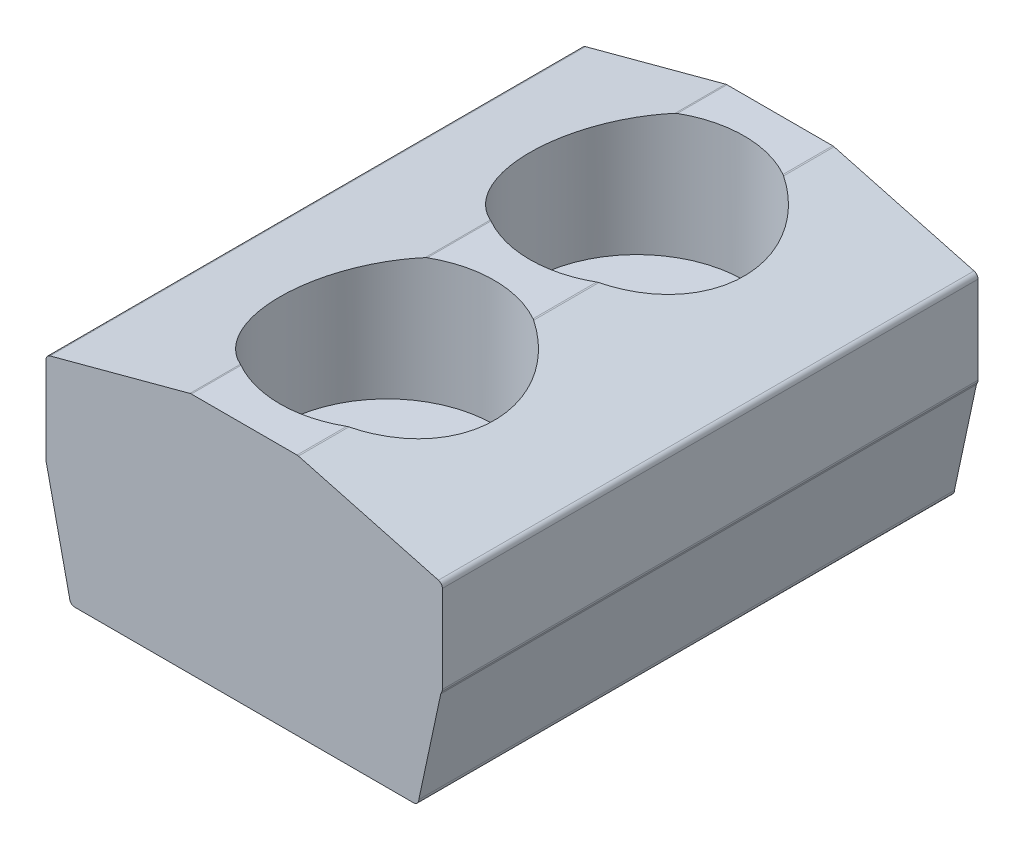
ISO-10303-21;
HEADER;
FILE_DESCRIPTION(('STEP AP214'),'2;1');
FILE_NAME('part.step','',(''),(''),'','','');
FILE_SCHEMA(('AUTOMOTIVE_DESIGN { 1 0 10303 214 1 1 1 1 }'));
ENDSEC;
DATA;
#1=APPLICATION_CONTEXT('core data for automotive mechanical design processes');
#2=APPLICATION_PROTOCOL_DEFINITION('international standard','automotive_design',2000,#1);
#3=PRODUCT_CONTEXT('',#1,'mechanical');
#4=PRODUCT('Part','Part','',(#3));
#5=PRODUCT_RELATED_PRODUCT_CATEGORY('part','',(#4));
#6=PRODUCT_DEFINITION_FORMATION('','',#4);
#7=PRODUCT_DEFINITION_CONTEXT('part definition',#1,'design');
#8=PRODUCT_DEFINITION('design','',#6,#7);
#9=PRODUCT_DEFINITION_SHAPE('','',#8);
#10=(LENGTH_UNIT() NAMED_UNIT(*) SI_UNIT(.MILLI.,.METRE.));
#11=(NAMED_UNIT(*) PLANE_ANGLE_UNIT() SI_UNIT($,.RADIAN.));
#12=(NAMED_UNIT(*) SI_UNIT($,.STERADIAN.) SOLID_ANGLE_UNIT());
#13=UNCERTAINTY_MEASURE_WITH_UNIT(LENGTH_MEASURE(1.E-05),#10,'distance_accuracy_value','');
#14=(GEOMETRIC_REPRESENTATION_CONTEXT(3) GLOBAL_UNCERTAINTY_ASSIGNED_CONTEXT((#13)) GLOBAL_UNIT_ASSIGNED_CONTEXT((#10,
#11,#12)) REPRESENTATION_CONTEXT('',''));
#15=CARTESIAN_POINT('',(0.,0.,0.));
#16=DIRECTION('',(0.,0.,1.));
#17=DIRECTION('',(1.,0.,0.));
#18=AXIS2_PLACEMENT_3D('',#15,#16,#17);
#19=CARTESIAN_POINT('',(3.65950834964065,10.7124404272445,8.));
#20=DIRECTION('',(0.,-1.,0.));
#21=DIRECTION('',(1.,0.,0.));
#22=AXIS2_PLACEMENT_3D('',#19,#20,#21);
#23=CYLINDRICAL_SURFACE('',#22,3.2);
#24=CARTESIAN_POINT('',(3.65950834964065,-2.89439986210309,8.));
#25=DIRECTION('',(0.,-1.,0.));
#26=DIRECTION('',(1.,0.,0.));
#27=AXIS2_PLACEMENT_3D('',#24,#25,#26);
#28=CIRCLE('',#27,3.2);
#29=CARTESIAN_POINT('',(6.85950834964065,-2.89439986210309,8.));
#30=VERTEX_POINT('',#29);
#31=EDGE_CURVE('E440',#30,#30,#28,.T.);
#32=ORIENTED_EDGE('',*,*,#31,.T.);
#33=EDGE_LOOP('',(#32));
#34=FACE_BOUND('',#33,.T.);
#35=CARTESIAN_POINT('',(3.65950834964065,3.7124404272445,8.));
#36=DIRECTION('',(0.,1.,0.));
#37=DIRECTION('',(0.,0.,1.));
#38=AXIS2_PLACEMENT_3D('',#35,#36,#37);
#39=CIRCLE('',#38,3.2);
#40=CARTESIAN_POINT('',(3.65950834964065,3.7124404272445,11.2));
#41=VERTEX_POINT('',#40);
#42=EDGE_CURVE('E527',#41,#41,#39,.F.);
#43=ORIENTED_EDGE('',*,*,#42,.F.);
#44=EDGE_LOOP('',(#43));
#45=FACE_BOUND('',#44,.T.);
#46=ADVANCED_FACE('F45',(#34,#45),#23,.F.);
#47=CARTESIAN_POINT('',(3.65950834964065,10.7124404272445,22.));
#48=DIRECTION('',(0.,-1.,0.));
#49=DIRECTION('',(1.,0.,0.));
#50=AXIS2_PLACEMENT_3D('',#47,#48,#49);
#51=CYLINDRICAL_SURFACE('',#50,3.2);
#52=CARTESIAN_POINT('',(3.65950834964065,-2.89439986210309,22.));
#53=DIRECTION('',(0.,-1.,0.));
#54=DIRECTION('',(1.,0.,0.));
#55=AXIS2_PLACEMENT_3D('',#52,#53,#54);
#56=CIRCLE('',#55,3.2);
#57=CARTESIAN_POINT('',(6.85950834964065,-2.89439986210309,22.));
#58=VERTEX_POINT('',#57);
#59=EDGE_CURVE('E390',#58,#58,#56,.T.);
#60=ORIENTED_EDGE('',*,*,#59,.T.);
#61=EDGE_LOOP('',(#60));
#62=FACE_BOUND('',#61,.T.);
#63=CARTESIAN_POINT('',(3.65950834964065,3.7124404272445,22.));
#64=DIRECTION('',(0.,1.,0.));
#65=DIRECTION('',(0.,0.,1.));
#66=AXIS2_PLACEMENT_3D('',#63,#64,#65);
#67=CIRCLE('',#66,3.2);
#68=CARTESIAN_POINT('',(3.65950834964065,3.7124404272445,25.2));
#69=VERTEX_POINT('',#68);
#70=EDGE_CURVE('E811',#69,#69,#67,.F.);
#71=ORIENTED_EDGE('',*,*,#70,.F.);
#72=EDGE_LOOP('',(#71));
#73=FACE_BOUND('',#72,.T.);
#74=ADVANCED_FACE('F558',(#62,#73),#51,.F.);
#75=CARTESIAN_POINT('',(6.62001260036443,10.4124404272445,30.));
#76=DIRECTION('',(0.,0.,-1.));
#77=DIRECTION('',(-1.,0.,0.));
#78=AXIS2_PLACEMENT_3D('',#75,#76,#77);
#79=CYLINDRICAL_SURFACE('',#78,0.3);
#80=DIRECTION('',(0.,0.,-1.));
#81=VECTOR('',#80,1.);
#82=CARTESIAN_POINT('',(6.69765831389518,10.7022181751312,30.));
#83=LINE('',#82,#81);
#84=CARTESIAN_POINT('',(6.69765831389518,10.7022181751312,30.));
#85=VERTEX_POINT('',#84);
#86=CARTESIAN_POINT('',(6.69765831389518,10.7022181751312,27.1739390018341));
#87=VERTEX_POINT('',#86);
#88=EDGE_CURVE('E233',#85,#87,#83,.T.);
#89=ORIENTED_EDGE('',*,*,#88,.T.);
#90=CARTESIAN_POINT('',(6.69765831389518,10.7022181751312,27.1739390018341));
#91=CARTESIAN_POINT('',(6.68494068704995,10.7056182745848,27.1814084927951));
#92=CARTESIAN_POINT('',(6.67211139749972,10.7081701786544,27.1888779912677));
#93=CARTESIAN_POINT('',(6.64622949298947,10.7115775960255,27.2038170032363));
#94=CARTESIAN_POINT('',(6.63317687802944,10.712433109327,27.2112865167322));
#95=CARTESIAN_POINT('',(6.62001260036442,10.7124404272445,27.2187560377399));
#96=B_SPLINE_CURVE_WITH_KNOTS('',3,(#90,#91,#92,#93,#94,#95),.UNSPECIFIED.,.F.,.F.,(4,2,4),(0.,
0.0451892313454202,0.0903784626901645),.UNSPECIFIED.);
#97=CARTESIAN_POINT('',(6.62001260036443,10.7124404272445,27.2187560377399));
#98=VERTEX_POINT('',#97);
#99=EDGE_CURVE('E213',#87,#98,#96,.T.);
#100=ORIENTED_EDGE('',*,*,#99,.T.);
#101=DIRECTION('',(0.,0.,-1.));
#102=VECTOR('',#101,1.);
#103=CARTESIAN_POINT('',(6.62001260036443,10.7124404272445,30.));
#104=LINE('',#103,#102);
#105=CARTESIAN_POINT('',(6.62001260036443,10.7124404272445,30.));
#106=VERTEX_POINT('',#105);
#107=EDGE_CURVE('E230',#106,#98,#104,.T.);
#108=ORIENTED_EDGE('',*,*,#107,.F.);
#109=CARTESIAN_POINT('',(6.62001260036443,10.4124404272445,30.));
#110=DIRECTION('',(0.,0.,1.));
#111=DIRECTION('',(1.,0.,0.));
#112=AXIS2_PLACEMENT_3D('',#109,#110,#111);
#113=CIRCLE('',#112,0.3);
#114=EDGE_CURVE('E431',#85,#106,#113,.T.);
#115=ORIENTED_EDGE('',*,*,#114,.F.);
#116=EDGE_LOOP('',(#89,#100,#108,#115));
#117=FACE_BOUND('',#116,.T.);
#118=ADVANCED_FACE('F228',(#117),#79,.T.);
#119=CARTESIAN_POINT('',(6.69765831389518,10.7022181751312,16.8260609981659));
#120=VERTEX_POINT('',#119);
#121=CARTESIAN_POINT('',(6.69765831389518,10.7022181751312,13.1739390018341));
#122=VERTEX_POINT('',#121);
#123=EDGE_CURVE('E246',#120,#122,#83,.T.);
#124=ORIENTED_EDGE('',*,*,#123,.T.);
#125=CARTESIAN_POINT('',(6.69765831389518,10.7022181751312,13.1739390018341));
#126=CARTESIAN_POINT('',(6.68494068704995,10.7056182745848,13.1814084927951));
#127=CARTESIAN_POINT('',(6.67211139749972,10.7081701786544,13.1888779912677));
#128=CARTESIAN_POINT('',(6.64622949298947,10.7115775960255,13.2038170032363));
#129=CARTESIAN_POINT('',(6.63317687802945,10.712433109327,13.2112865167322));
#130=CARTESIAN_POINT('',(6.62001260036443,10.7124404272445,13.2187560377399));
#131=B_SPLINE_CURVE_WITH_KNOTS('',3,(#125,#126,#127,#128,#129,#130),.UNSPECIFIED.,.F.,.F.,(4,2,
4),(0.,0.0451892313454202,0.0903784626901631),.UNSPECIFIED.);
#132=CARTESIAN_POINT('',(6.62001260036443,10.7124404272445,13.2187560377399));
#133=VERTEX_POINT('',#132);
#134=EDGE_CURVE('E444',#122,#133,#131,.T.);
#135=ORIENTED_EDGE('',*,*,#134,.T.);
#136=CARTESIAN_POINT('',(6.62001260036443,10.7124404272445,16.7812439622601));
#137=VERTEX_POINT('',#136);
#138=EDGE_CURVE('E241',#137,#133,#104,.T.);
#139=ORIENTED_EDGE('',*,*,#138,.F.);
#140=CARTESIAN_POINT('',(6.62001260036443,10.7124404272445,16.7812439622601));
#141=CARTESIAN_POINT('',(6.63317687802944,10.712433109327,16.7887134832678));
#142=CARTESIAN_POINT('',(6.64622949298947,10.7115775960255,16.7961829967637));
#143=CARTESIAN_POINT('',(6.67211139749972,10.7081701786544,16.8111220087323));
#144=CARTESIAN_POINT('',(6.68494068704995,10.7056182745848,16.8185915072049));
#145=CARTESIAN_POINT('',(6.69765831389518,10.7022181751312,16.8260609981659));
#146=B_SPLINE_CURVE_WITH_KNOTS('',3,(#140,#141,#142,#143,#144,#145),.UNSPECIFIED.,.F.,.F.,(4,2,
4),(0.,0.0451892313447453,0.0903784626901623),.UNSPECIFIED.);
#147=EDGE_CURVE('E235',#137,#120,#146,.T.);
#148=ORIENTED_EDGE('',*,*,#147,.T.);
#149=EDGE_LOOP('',(#124,#135,#139,#148));
#150=FACE_BOUND('',#149,.T.);
#151=ADVANCED_FACE('F553',(#150),#79,.T.);
#152=CARTESIAN_POINT('',(6.62001260036443,10.7124404272445,30.));
#153=DIRECTION('',(0.,-1.,0.));
#154=DIRECTION('',(0.,0.,-1.));
#155=AXIS2_PLACEMENT_3D('',#152,#153,#154);
#156=PLANE('',#155);
#157=ORIENTED_EDGE('',*,*,#107,.T.);
#158=CARTESIAN_POINT('',(3.65950834964065,10.7124404272445,22.));
#159=DIRECTION('',(0.,1.,0.));
#160=DIRECTION('',(0.,0.,1.));
#161=AXIS2_PLACEMENT_3D('',#158,#159,#160);
#162=CIRCLE('',#161,6.);
#163=CARTESIAN_POINT('',(0.699004098916885,10.7124404272445,27.2187560377399));
#164=VERTEX_POINT('',#163);
#165=EDGE_CURVE('E210',#164,#98,#162,.T.);
#166=ORIENTED_EDGE('',*,*,#165,.F.);
#167=DIRECTION('',(0.,0.,-1.));
#168=VECTOR('',#167,1.);
#169=CARTESIAN_POINT('',(0.699004098916885,10.7124404272445,30.));
#170=LINE('',#169,#168);
#171=CARTESIAN_POINT('',(0.699004098916885,10.7124404272445,30.));
#172=VERTEX_POINT('',#171);
#173=EDGE_CURVE('E251',#172,#164,#170,.T.);
#174=ORIENTED_EDGE('',*,*,#173,.F.);
#175=DIRECTION('',(-1.,0.,0.));
#176=VECTOR('',#175,1.);
#177=CARTESIAN_POINT('',(6.62001260036443,10.7124404272445,30.));
#178=LINE('',#177,#176);
#179=EDGE_CURVE('E238',#106,#172,#178,.T.);
#180=ORIENTED_EDGE('',*,*,#179,.F.);
#181=EDGE_LOOP('',(#157,#166,#174,#180));
#182=FACE_BOUND('',#181,.T.);
#183=ADVANCED_FACE('F237',(#182),#156,.F.);
#184=ORIENTED_EDGE('',*,*,#138,.T.);
#185=CARTESIAN_POINT('',(3.65950834964065,10.7124404272445,8.));
#186=DIRECTION('',(0.,1.,0.));
#187=DIRECTION('',(0.,0.,1.));
#188=AXIS2_PLACEMENT_3D('',#185,#186,#187);
#189=CIRCLE('',#188,6.);
#190=CARTESIAN_POINT('',(0.699004098916885,10.7124404272445,13.2187560377399));
#191=VERTEX_POINT('',#190);
#192=EDGE_CURVE('E825',#191,#133,#189,.T.);
#193=ORIENTED_EDGE('',*,*,#192,.F.);
#194=CARTESIAN_POINT('',(0.699004098916885,10.7124404272445,16.7812439622601));
#195=VERTEX_POINT('',#194);
#196=EDGE_CURVE('E258',#195,#191,#170,.T.);
#197=ORIENTED_EDGE('',*,*,#196,.F.);
#198=EDGE_CURVE('E222',#137,#195,#162,.T.);
#199=ORIENTED_EDGE('',*,*,#198,.F.);
#200=EDGE_LOOP('',(#184,#193,#197,#199));
#201=FACE_BOUND('',#200,.T.);
#202=ADVANCED_FACE('F548',(#201),#156,.F.);
#203=CARTESIAN_POINT('',(0.699004098916885,10.4124404272445,30.));
#204=DIRECTION('',(0.,0.,-1.));
#205=DIRECTION('',(-1.,0.,0.));
#206=AXIS2_PLACEMENT_3D('',#203,#204,#205);
#207=CYLINDRICAL_SURFACE('',#206,0.3);
#208=ORIENTED_EDGE('',*,*,#173,.T.);
#209=CARTESIAN_POINT('',(0.699004098916885,10.7124404272445,27.2187560377399));
#210=CARTESIAN_POINT('',(0.685839821251867,10.712433109327,27.2112865167322));
#211=CARTESIAN_POINT('',(0.672787206291843,10.7115775960255,27.2038170032363));
#212=CARTESIAN_POINT('',(0.64690530178159,10.7081701786544,27.1888779912677));
#213=CARTESIAN_POINT('',(0.634076012231364,10.7056182745848,27.1814084927951));
#214=CARTESIAN_POINT('',(0.621358385386135,10.7022181751312,27.1739390018341));
#215=B_SPLINE_CURVE_WITH_KNOTS('',3,(#209,#210,#211,#212,#213,#214),.UNSPECIFIED.,.F.,.F.,(4,2,
4),(0.,0.0451892313447418,0.0903784626901581),.UNSPECIFIED.);
#216=CARTESIAN_POINT('',(0.621358385386134,10.7022181751312,27.1739390018341));
#217=VERTEX_POINT('',#216);
#218=EDGE_CURVE('E216',#164,#217,#215,.T.);
#219=ORIENTED_EDGE('',*,*,#218,.T.);
#220=DIRECTION('',(0.,0.,-1.));
#221=VECTOR('',#220,1.);
#222=CARTESIAN_POINT('',(0.621358385386134,10.7022181751312,30.));
#223=LINE('',#222,#221);
#224=CARTESIAN_POINT('',(0.621358385386134,10.7022181751312,30.));
#225=VERTEX_POINT('',#224);
#226=EDGE_CURVE('E266',#225,#217,#223,.T.);
#227=ORIENTED_EDGE('',*,*,#226,.F.);
#228=CARTESIAN_POINT('',(0.699004098916885,10.4124404272445,30.));
#229=DIRECTION('',(0.,0.,1.));
#230=DIRECTION('',(1.,0.,0.));
#231=AXIS2_PLACEMENT_3D('',#228,#229,#230);
#232=CIRCLE('',#231,0.3);
#233=EDGE_CURVE('E426',#172,#225,#232,.T.);
#234=ORIENTED_EDGE('',*,*,#233,.F.);
#235=EDGE_LOOP('',(#208,#219,#227,#234));
#236=FACE_BOUND('',#235,.T.);
#237=ADVANCED_FACE('F520',(#236),#207,.T.);
#238=ORIENTED_EDGE('',*,*,#196,.T.);
#239=CARTESIAN_POINT('',(0.699004098916885,10.7124404272445,13.2187560377399));
#240=CARTESIAN_POINT('',(0.685839821251867,10.712433109327,13.2112865167322));
#241=CARTESIAN_POINT('',(0.672787206291843,10.7115775960255,13.2038170032363));
#242=CARTESIAN_POINT('',(0.646905301781589,10.7081701786544,13.1888779912677));
#243=CARTESIAN_POINT('',(0.634076012231363,10.7056182745848,13.1814084927951));
#244=CARTESIAN_POINT('',(0.621358385386133,10.7022181751312,13.1739390018341));
#245=B_SPLINE_CURVE_WITH_KNOTS('',3,(#239,#240,#241,#242,#243,#244),.UNSPECIFIED.,.F.,.F.,(4,2,
4),(0.,0.0451892313447426,0.0903784626901613),.UNSPECIFIED.);
#246=CARTESIAN_POINT('',(0.621358385386134,10.7022181751312,13.1739390018341));
#247=VERTEX_POINT('',#246);
#248=EDGE_CURVE('E482',#191,#247,#245,.T.);
#249=ORIENTED_EDGE('',*,*,#248,.T.);
#250=CARTESIAN_POINT('',(0.621358385386134,10.7022181751312,16.8260609981659));
#251=VERTEX_POINT('',#250);
#252=EDGE_CURVE('E272',#251,#247,#223,.T.);
#253=ORIENTED_EDGE('',*,*,#252,.F.);
#254=CARTESIAN_POINT('',(0.621358385386134,10.7022181751312,16.8260609981659));
#255=CARTESIAN_POINT('',(0.634076012231363,10.7056182745848,16.8185915072049));
#256=CARTESIAN_POINT('',(0.646905301781589,10.7081701786544,16.8111220087323));
#257=CARTESIAN_POINT('',(0.672787206291843,10.7115775960255,16.7961829967637));
#258=CARTESIAN_POINT('',(0.685839821251867,10.712433109327,16.7887134832678));
#259=CARTESIAN_POINT('',(0.699004098916885,10.7124404272445,16.7812439622601));
#260=B_SPLINE_CURVE_WITH_KNOTS('',3,(#254,#255,#256,#257,#258,#259),.UNSPECIFIED.,.F.,.F.,(4,2,
4),(0.,0.0451892313454174,0.0903784626901597),.UNSPECIFIED.);
#261=EDGE_CURVE('E68',#251,#195,#260,.T.);
#262=ORIENTED_EDGE('',*,*,#261,.T.);
#263=EDGE_LOOP('',(#238,#249,#253,#262));
#264=FACE_BOUND('',#263,.T.);
#265=ADVANCED_FACE('F542',(#264),#207,.T.);
#266=CARTESIAN_POINT('',(14.4595083496407,8.31185387215871,30.));
#267=DIRECTION('',(0.,0.,-1.));
#268=DIRECTION('',(-1.,0.,0.));
#269=AXIS2_PLACEMENT_3D('',#266,#267,#268);
#270=CYLINDRICAL_SURFACE('',#269,0.3);
#271=CARTESIAN_POINT('',(14.4595083496407,8.31185387215871,0.));
#272=DIRECTION('',(0.,0.,1.));
#273=DIRECTION('',(1.,0.,0.));
#274=AXIS2_PLACEMENT_3D('',#271,#272,#273);
#275=CIRCLE('',#274,0.3);
#276=CARTESIAN_POINT('',(14.7595083496407,8.31185387215871,0.));
#277=VERTEX_POINT('',#276);
#278=CARTESIAN_POINT('',(14.5371540631714,8.60163162004543,0.));
#279=VERTEX_POINT('',#278);
#280=EDGE_CURVE('E386',#277,#279,#275,.T.);
#281=ORIENTED_EDGE('',*,*,#280,.T.);
#282=DIRECTION('',(0.,0.,-1.));
#283=VECTOR('',#282,1.);
#284=CARTESIAN_POINT('',(14.5371540631714,8.60163162004543,30.));
#285=LINE('',#284,#283);
#286=CARTESIAN_POINT('',(14.5371540631714,8.60163162004543,30.));
#287=VERTEX_POINT('',#286);
#288=EDGE_CURVE('E802',#287,#279,#285,.T.);
#289=ORIENTED_EDGE('',*,*,#288,.F.);
#290=CARTESIAN_POINT('',(14.4595083496407,8.31185387215871,30.));
#291=DIRECTION('',(0.,0.,1.));
#292=DIRECTION('',(1.,0.,0.));
#293=AXIS2_PLACEMENT_3D('',#290,#291,#292);
#294=CIRCLE('',#293,0.3);
#295=CARTESIAN_POINT('',(14.7595083496407,8.31185387215871,30.));
#296=VERTEX_POINT('',#295);
#297=EDGE_CURVE('E339',#296,#287,#294,.T.);
#298=ORIENTED_EDGE('',*,*,#297,.F.);
#299=DIRECTION('',(0.,0.,-1.));
#300=VECTOR('',#299,1.);
#301=CARTESIAN_POINT('',(14.7595083496407,8.31185387215871,30.));
#302=LINE('',#301,#300);
#303=EDGE_CURVE('E331',#296,#277,#302,.T.);
#304=ORIENTED_EDGE('',*,*,#303,.T.);
#305=EDGE_LOOP('',(#281,#289,#298,#304));
#306=FACE_BOUND('',#305,.T.);
#307=ADVANCED_FACE('F47',(#306),#270,.T.);
#308=CARTESIAN_POINT('',(8.4920826036523,10.221403635812,30.));
#309=DIRECTION('',(-0.258819045102521,-0.965925826289068,0.));
#310=DIRECTION('',(0.965925826289068,-0.258819045102521,0.));
#311=AXIS2_PLACEMENT_3D('',#308,#309,#310);
#312=PLANE('',#311);
#313=CARTESIAN_POINT('',(6.69765831389518,10.7022181751312,2.82606099816588));
#314=VERTEX_POINT('',#313);
#315=CARTESIAN_POINT('',(6.69765831389518,10.7022181751312,0.));
#316=VERTEX_POINT('',#315);
#317=EDGE_CURVE('E240',#314,#316,#83,.T.);
#318=ORIENTED_EDGE('',*,*,#317,.F.);
#319=CARTESIAN_POINT('',(3.65950834964065,11.5162880045379,8.));
#320=DIRECTION('',(-0.258819045102521,-0.965925826289068,0.));
#321=DIRECTION('',(-0.965925826289068,0.258819045102521,0.));
#322=AXIS2_PLACEMENT_3D('',#319,#320,#321);
#323=ELLIPSE('',#322,6.2116570824605,6.);
#324=EDGE_CURVE('E457',#314,#122,#323,.T.);
#325=ORIENTED_EDGE('',*,*,#324,.T.);
#326=ORIENTED_EDGE('',*,*,#123,.F.);
#327=CARTESIAN_POINT('',(3.65950834964065,11.5162880045379,22.));
#328=DIRECTION('',(-0.258819045102521,-0.965925826289068,0.));
#329=DIRECTION('',(-0.965925826289068,0.258819045102521,0.));
#330=AXIS2_PLACEMENT_3D('',#327,#328,#329);
#331=ELLIPSE('',#330,6.2116570824605,6.);
#332=EDGE_CURVE('E522',#120,#87,#331,.T.);
#333=ORIENTED_EDGE('',*,*,#332,.T.);
#334=ORIENTED_EDGE('',*,*,#88,.F.);
#335=DIRECTION('',(-0.965925826289068,0.258819045102521,0.));
#336=VECTOR('',#335,1.);
#337=CARTESIAN_POINT('',(14.5371540631714,8.60163162004543,30.));
#338=LINE('',#337,#336);
#339=EDGE_CURVE('E434',#287,#85,#338,.T.);
#340=ORIENTED_EDGE('',*,*,#339,.F.);
#341=ORIENTED_EDGE('',*,*,#288,.T.);
#342=DIRECTION('',(-0.965925826289068,0.258819045102521,0.));
#343=VECTOR('',#342,1.);
#344=CARTESIAN_POINT('',(8.4920826036523,10.221403635812,0.));
#345=LINE('',#344,#343);
#346=EDGE_CURVE('E382',#279,#316,#345,.T.);
#347=ORIENTED_EDGE('',*,*,#346,.T.);
#348=EDGE_LOOP('',(#318,#325,#326,#333,#334,#340,#341,#347));
#349=FACE_BOUND('',#348,.T.);
#350=ADVANCED_FACE('F552',(#349),#312,.F.);
#351=CARTESIAN_POINT('',(6.62001260036443,10.7124404272445,2.78124396226012));
#352=VERTEX_POINT('',#351);
#353=CARTESIAN_POINT('',(6.62001260036443,10.7124404272445,0.));
#354=VERTEX_POINT('',#353);
#355=EDGE_CURVE('E243',#352,#354,#104,.T.);
#356=ORIENTED_EDGE('',*,*,#355,.F.);
#357=CARTESIAN_POINT('',(6.62001260036443,10.7124404272445,2.78124396226012));
#358=CARTESIAN_POINT('',(6.63317687802944,10.712433109327,2.78871348326777));
#359=CARTESIAN_POINT('',(6.64622949298947,10.7115775960255,2.79618299676372));
#360=CARTESIAN_POINT('',(6.67211139749972,10.7081701786544,2.81112200873231));
#361=CARTESIAN_POINT('',(6.68494068704995,10.7056182745848,2.81859150720495));
#362=CARTESIAN_POINT('',(6.69765831389518,10.7022181751312,2.82606099816588));
#363=B_SPLINE_CURVE_WITH_KNOTS('',3,(#357,#358,#359,#360,#361,#362),.UNSPECIFIED.,.F.,.F.,(4,2,
4),(0.,0.0451892313447434,0.0903784626901627),.UNSPECIFIED.);
#364=EDGE_CURVE('E487',#352,#314,#363,.T.);
#365=ORIENTED_EDGE('',*,*,#364,.T.);
#366=ORIENTED_EDGE('',*,*,#317,.T.);
#367=CARTESIAN_POINT('',(6.62001260036443,10.4124404272445,0.));
#368=DIRECTION('',(0.,0.,1.));
#369=DIRECTION('',(1.,0.,0.));
#370=AXIS2_PLACEMENT_3D('',#367,#368,#369);
#371=CIRCLE('',#370,0.3);
#372=EDGE_CURVE('E379',#316,#354,#371,.T.);
#373=ORIENTED_EDGE('',*,*,#372,.T.);
#374=EDGE_LOOP('',(#356,#365,#366,#373));
#375=FACE_BOUND('',#374,.T.);
#376=ADVANCED_FACE('F459',(#375),#79,.T.);
#377=CARTESIAN_POINT('',(0.699004098916885,10.7124404272445,2.78124396226012));
#378=VERTEX_POINT('',#377);
#379=CARTESIAN_POINT('',(0.699004098916885,10.7124404272445,0.));
#380=VERTEX_POINT('',#379);
#381=EDGE_CURVE('E259',#378,#380,#170,.T.);
#382=ORIENTED_EDGE('',*,*,#381,.F.);
#383=EDGE_CURVE('E505',#352,#378,#189,.T.);
#384=ORIENTED_EDGE('',*,*,#383,.F.);
#385=ORIENTED_EDGE('',*,*,#355,.T.);
#386=DIRECTION('',(-1.,0.,0.));
#387=VECTOR('',#386,1.);
#388=CARTESIAN_POINT('',(6.62001260036443,10.7124404272445,0.));
#389=LINE('',#388,#387);
#390=EDGE_CURVE('E376',#354,#380,#389,.T.);
#391=ORIENTED_EDGE('',*,*,#390,.T.);
#392=EDGE_LOOP('',(#382,#384,#385,#391));
#393=FACE_BOUND('',#392,.T.);
#394=ADVANCED_FACE('F504',(#393),#156,.F.);
#395=CARTESIAN_POINT('',(0.621358385386134,10.7022181751312,2.82606099816589));
#396=VERTEX_POINT('',#395);
#397=CARTESIAN_POINT('',(0.621358385386134,10.7022181751312,0.));
#398=VERTEX_POINT('',#397);
#399=EDGE_CURVE('E273',#396,#398,#223,.T.);
#400=ORIENTED_EDGE('',*,*,#399,.F.);
#401=CARTESIAN_POINT('',(0.621358385386134,10.7022181751312,2.82606099816588));
#402=CARTESIAN_POINT('',(0.634076012231363,10.7056182745848,2.81859150720495));
#403=CARTESIAN_POINT('',(0.646905301781589,10.7081701786544,2.81112200873231));
#404=CARTESIAN_POINT('',(0.672787206291843,10.7115775960255,2.79618299676372));
#405=CARTESIAN_POINT('',(0.685839821251867,10.712433109327,2.78871348326777));
#406=CARTESIAN_POINT('',(0.699004098916885,10.7124404272445,2.78124396226012));
#407=B_SPLINE_CURVE_WITH_KNOTS('',3,(#401,#402,#403,#404,#405,#406),.UNSPECIFIED.,.F.,.F.,(4,2,
4),(0.,0.0451892313454184,0.0903784626901609),.UNSPECIFIED.);
#408=EDGE_CURVE('E61',#396,#378,#407,.T.);
#409=ORIENTED_EDGE('',*,*,#408,.T.);
#410=ORIENTED_EDGE('',*,*,#381,.T.);
#411=CARTESIAN_POINT('',(0.699004098916885,10.4124404272445,0.));
#412=DIRECTION('',(0.,0.,1.));
#413=DIRECTION('',(1.,0.,0.));
#414=AXIS2_PLACEMENT_3D('',#411,#412,#413);
#415=CIRCLE('',#414,0.3);
#416=EDGE_CURVE('E373',#380,#398,#415,.T.);
#417=ORIENTED_EDGE('',*,*,#416,.T.);
#418=EDGE_LOOP('',(#400,#409,#410,#417));
#419=FACE_BOUND('',#418,.T.);
#420=ADVANCED_FACE('F503',(#419),#207,.T.);
#421=CARTESIAN_POINT('',(-5.6079173963477,9.03308875998489,30.));
#422=DIRECTION('',(0.258819045102522,-0.965925826289068,0.));
#423=DIRECTION('',(0.965925826289068,0.258819045102522,0.));
#424=AXIS2_PLACEMENT_3D('',#421,#422,#423);
#425=PLANE('',#424);
#426=ORIENTED_EDGE('',*,*,#252,.T.);
#427=CARTESIAN_POINT('',(3.65950834964065,11.5162880045379,8.));
#428=DIRECTION('',(0.258819045102522,-0.965925826289068,0.));
#429=DIRECTION('',(0.965925826289068,0.258819045102522,0.));
#430=AXIS2_PLACEMENT_3D('',#427,#428,#429);
#431=ELLIPSE('',#430,6.2116570824605,6.);
#432=EDGE_CURVE('E11',#247,#396,#431,.T.);
#433=ORIENTED_EDGE('',*,*,#432,.T.);
#434=ORIENTED_EDGE('',*,*,#399,.T.);
#435=DIRECTION('',(-0.965925826289068,-0.258819045102522,0.));
#436=VECTOR('',#435,1.);
#437=CARTESIAN_POINT('',(-5.6079173963477,9.03308875998489,0.));
#438=LINE('',#437,#436);
#439=CARTESIAN_POINT('',(-7.2181373638901,8.60163162004543,0.));
#440=VERTEX_POINT('',#439);
#441=EDGE_CURVE('E370',#398,#440,#438,.T.);
#442=ORIENTED_EDGE('',*,*,#441,.T.);
#443=DIRECTION('',(0.,0.,-1.));
#444=VECTOR('',#443,1.);
#445=CARTESIAN_POINT('',(-7.2181373638901,8.60163162004543,30.));
#446=LINE('',#445,#444);
#447=CARTESIAN_POINT('',(-7.2181373638901,8.60163162004543,30.));
#448=VERTEX_POINT('',#447);
#449=EDGE_CURVE('E281',#448,#440,#446,.T.);
#450=ORIENTED_EDGE('',*,*,#449,.F.);
#451=DIRECTION('',(-0.965925826289068,-0.258819045102521,0.));
#452=VECTOR('',#451,1.);
#453=CARTESIAN_POINT('',(0.621358385386133,10.7022181751312,30.));
#454=LINE('',#453,#452);
#455=EDGE_CURVE('E423',#225,#448,#454,.T.);
#456=ORIENTED_EDGE('',*,*,#455,.F.);
#457=ORIENTED_EDGE('',*,*,#226,.T.);
#458=CARTESIAN_POINT('',(3.65950834964065,11.5162880045379,22.));
#459=DIRECTION('',(0.258819045102522,-0.965925826289068,0.));
#460=DIRECTION('',(0.965925826289068,0.258819045102522,0.));
#461=AXIS2_PLACEMENT_3D('',#458,#459,#460);
#462=ELLIPSE('',#461,6.2116570824605,6.);
#463=EDGE_CURVE('E54',#217,#251,#462,.T.);
#464=ORIENTED_EDGE('',*,*,#463,.T.);
#465=EDGE_LOOP('',(#426,#433,#434,#442,#450,#456,#457,#464));
#466=FACE_BOUND('',#465,.T.);
#467=ADVANCED_FACE('F513',(#466),#425,.F.);
#468=CARTESIAN_POINT('',(-7.14049165035934,8.31185387215871,30.));
#469=DIRECTION('',(0.,0.,-1.));
#470=DIRECTION('',(-1.,0.,0.));
#471=AXIS2_PLACEMENT_3D('',#468,#469,#470);
#472=CYLINDRICAL_SURFACE('',#471,0.3);
#473=CARTESIAN_POINT('',(-7.14049165035934,8.31185387215871,0.));
#474=DIRECTION('',(0.,0.,1.));
#475=DIRECTION('',(1.,0.,0.));
#476=AXIS2_PLACEMENT_3D('',#473,#474,#475);
#477=CIRCLE('',#476,0.3);
#478=CARTESIAN_POINT('',(-7.44049165035934,8.31185387215871,0.));
#479=VERTEX_POINT('',#478);
#480=EDGE_CURVE('E367',#440,#479,#477,.T.);
#481=ORIENTED_EDGE('',*,*,#480,.T.);
#482=DIRECTION('',(0.,0.,-1.));
#483=VECTOR('',#482,1.);
#484=CARTESIAN_POINT('',(-7.44049165035934,8.31185387215871,30.));
#485=LINE('',#484,#483);
#486=CARTESIAN_POINT('',(-7.44049165035934,8.31185387215871,30.));
#487=VERTEX_POINT('',#486);
#488=EDGE_CURVE('E286',#487,#479,#485,.T.);
#489=ORIENTED_EDGE('',*,*,#488,.F.);
#490=CARTESIAN_POINT('',(-7.14049165035934,8.31185387215871,30.));
#491=DIRECTION('',(0.,0.,1.));
#492=DIRECTION('',(1.,0.,0.));
#493=AXIS2_PLACEMENT_3D('',#490,#491,#492);
#494=CIRCLE('',#493,0.3);
#495=EDGE_CURVE('E420',#448,#487,#494,.T.);
#496=ORIENTED_EDGE('',*,*,#495,.F.);
#497=ORIENTED_EDGE('',*,*,#449,.T.);
#498=EDGE_LOOP('',(#481,#489,#496,#497));
#499=FACE_BOUND('',#498,.T.);
#500=ADVANCED_FACE('F515',(#499),#472,.T.);
#501=CARTESIAN_POINT('',(-7.44049165035934,8.31185387215871,30.));
#502=DIRECTION('',(1.,0.,0.));
#503=DIRECTION('',(0.,0.,-1.));
#504=AXIS2_PLACEMENT_3D('',#501,#502,#503);
#505=PLANE('',#504);
#506=DIRECTION('',(0.,-1.,0.));
#507=VECTOR('',#506,1.);
#508=CARTESIAN_POINT('',(-7.44049165035934,8.31185387215871,0.));
#509=LINE('',#508,#507);
#510=CARTESIAN_POINT('',(-7.44049165035934,3.41490959629165,0.));
#511=VERTEX_POINT('',#510);
#512=EDGE_CURVE('E364',#479,#511,#509,.T.);
#513=ORIENTED_EDGE('',*,*,#512,.T.);
#514=DIRECTION('',(0.,0.,-1.));
#515=VECTOR('',#514,1.);
#516=CARTESIAN_POINT('',(-7.44049165035934,3.41490959629165,30.));
#517=LINE('',#516,#515);
#518=CARTESIAN_POINT('',(-7.44049165035934,3.41490959629165,30.));
#519=VERTEX_POINT('',#518);
#520=EDGE_CURVE('E293',#519,#511,#517,.T.);
#521=ORIENTED_EDGE('',*,*,#520,.F.);
#522=DIRECTION('',(0.,-1.,0.));
#523=VECTOR('',#522,1.);
#524=CARTESIAN_POINT('',(-7.44049165035934,8.31185387215871,30.));
#525=LINE('',#524,#523);
#526=EDGE_CURVE('E417',#487,#519,#525,.T.);
#527=ORIENTED_EDGE('',*,*,#526,.F.);
#528=ORIENTED_EDGE('',*,*,#488,.T.);
#529=EDGE_LOOP('',(#513,#521,#527,#528));
#530=FACE_BOUND('',#529,.T.);
#531=ADVANCED_FACE('F607',(#530),#505,.F.);
#532=CARTESIAN_POINT('',(-7.14049165035934,3.41490959629165,30.));
#533=DIRECTION('',(0.,0.,-1.));
#534=DIRECTION('',(-1.,0.,0.));
#535=AXIS2_PLACEMENT_3D('',#532,#533,#534);
#536=CYLINDRICAL_SURFACE('',#535,0.3);
#537=CARTESIAN_POINT('',(-7.14049165035934,3.41490959629165,0.));
#538=DIRECTION('',(0.,0.,1.));
#539=DIRECTION('',(1.,0.,0.));
#540=AXIS2_PLACEMENT_3D('',#537,#538,#539);
#541=CIRCLE('',#540,0.3);
#542=CARTESIAN_POINT('',(-7.41440072039973,3.29254202971614,0.));
#543=VERTEX_POINT('',#542);
#544=EDGE_CURVE('E361',#511,#543,#541,.T.);
#545=ORIENTED_EDGE('',*,*,#544,.T.);
#546=DIRECTION('',(0.,0.,-1.));
#547=VECTOR('',#546,1.);
#548=CARTESIAN_POINT('',(-7.41440072039973,3.29254202971614,30.));
#549=LINE('',#548,#547);
#550=CARTESIAN_POINT('',(-7.41440072039973,3.29254202971614,30.));
#551=VERTEX_POINT('',#550);
#552=EDGE_CURVE('E299',#551,#543,#549,.T.);
#553=ORIENTED_EDGE('',*,*,#552,.F.);
#554=CARTESIAN_POINT('',(-7.14049165035934,3.41490959629165,30.));
#555=DIRECTION('',(0.,0.,1.));
#556=DIRECTION('',(1.,0.,0.));
#557=AXIS2_PLACEMENT_3D('',#554,#555,#556);
#558=CIRCLE('',#557,0.3);
#559=EDGE_CURVE('E414',#519,#551,#558,.T.);
#560=ORIENTED_EDGE('',*,*,#559,.F.);
#561=ORIENTED_EDGE('',*,*,#520,.T.);
#562=EDGE_LOOP('',(#545,#553,#560,#561));
#563=FACE_BOUND('',#562,.T.);
#564=ADVANCED_FACE('F603',(#563),#536,.T.);
#565=CARTESIAN_POINT('',(-7.41440072039973,3.29254202971614,30.));
#566=DIRECTION('',(0.976700238967525,0.214608115412207,0.));
#567=DIRECTION('',(-0.214608115412207,0.976700238967525,0.));
#568=AXIS2_PLACEMENT_3D('',#565,#566,#567);
#569=PLANE('',#568);
#570=DIRECTION('',(0.214608115412207,-0.976700238967525,0.));
#571=VECTOR('',#570,1.);
#572=CARTESIAN_POINT('',(-7.41440072039973,3.29254202971614,0.));
#573=LINE('',#572,#571);
#574=CARTESIAN_POINT('',(-6.12087640808869,-2.59439986210309,0.));
#575=VERTEX_POINT('',#574);
#576=EDGE_CURVE('E358',#543,#575,#573,.T.);
#577=ORIENTED_EDGE('',*,*,#576,.T.);
#578=DIRECTION('',(0.,0.,-1.));
#579=VECTOR('',#578,1.);
#580=CARTESIAN_POINT('',(-6.12087640808869,-2.59439986210309,30.));
#581=LINE('',#580,#579);
#582=CARTESIAN_POINT('',(-6.12087640808869,-2.59439986210309,30.));
#583=VERTEX_POINT('',#582);
#584=EDGE_CURVE('E303',#583,#575,#581,.T.);
#585=ORIENTED_EDGE('',*,*,#584,.F.);
#586=DIRECTION('',(0.214608115412207,-0.976700238967525,0.));
#587=VECTOR('',#586,1.);
#588=CARTESIAN_POINT('',(-7.41440072039973,3.29254202971614,30.));
#589=LINE('',#588,#587);
#590=EDGE_CURVE('E411',#551,#583,#589,.T.);
#591=ORIENTED_EDGE('',*,*,#590,.F.);
#592=ORIENTED_EDGE('',*,*,#552,.T.);
#593=EDGE_LOOP('',(#577,#585,#591,#592));
#594=FACE_BOUND('',#593,.T.);
#595=ADVANCED_FACE('F599',(#594),#569,.F.);
#596=CARTESIAN_POINT('',(-5.82087640808869,-2.59439986210309,30.));
#597=DIRECTION('',(0.,0.,-1.));
#598=DIRECTION('',(-1.,0.,0.));
#599=AXIS2_PLACEMENT_3D('',#596,#597,#598);
#600=CYLINDRICAL_SURFACE('',#599,0.3);
#601=CARTESIAN_POINT('',(-5.82087640808869,-2.59439986210309,0.));
#602=DIRECTION('',(0.,0.,1.));
#603=DIRECTION('',(1.,0.,0.));
#604=AXIS2_PLACEMENT_3D('',#601,#602,#603);
#605=CIRCLE('',#604,0.3);
#606=CARTESIAN_POINT('',(-5.82087640808869,-2.89439986210309,0.));
#607=VERTEX_POINT('',#606);
#608=EDGE_CURVE('E355',#575,#607,#605,.T.);
#609=ORIENTED_EDGE('',*,*,#608,.T.);
#610=DIRECTION('',(0.,0.,-1.));
#611=VECTOR('',#610,1.);
#612=CARTESIAN_POINT('',(-5.82087640808869,-2.89439986210309,30.));
#613=LINE('',#612,#611);
#614=CARTESIAN_POINT('',(-5.82087640808869,-2.89439986210309,30.));
#615=VERTEX_POINT('',#614);
#616=EDGE_CURVE('E307',#615,#607,#613,.T.);
#617=ORIENTED_EDGE('',*,*,#616,.F.);
#618=CARTESIAN_POINT('',(-5.82087640808869,-2.59439986210309,30.));
#619=DIRECTION('',(0.,0.,1.));
#620=DIRECTION('',(1.,0.,0.));
#621=AXIS2_PLACEMENT_3D('',#618,#619,#620);
#622=CIRCLE('',#621,0.3);
#623=EDGE_CURVE('E408',#583,#615,#622,.T.);
#624=ORIENTED_EDGE('',*,*,#623,.F.);
#625=ORIENTED_EDGE('',*,*,#584,.T.);
#626=EDGE_LOOP('',(#609,#617,#624,#625));
#627=FACE_BOUND('',#626,.T.);
#628=ADVANCED_FACE('F595',(#627),#600,.T.);
#629=CARTESIAN_POINT('',(-5.82087640808869,-2.89439986210309,30.));
#630=DIRECTION('',(0.,1.,0.));
#631=DIRECTION('',(-1.,0.,0.));
#632=AXIS2_PLACEMENT_3D('',#629,#630,#631);
#633=PLANE('',#632);
#634=ORIENTED_EDGE('',*,*,#59,.F.);
#635=EDGE_LOOP('',(#634));
#636=FACE_BOUND('',#635,.T.);
#637=ORIENTED_EDGE('',*,*,#31,.F.);
#638=EDGE_LOOP('',(#637));
#639=FACE_BOUND('',#638,.T.);
#640=DIRECTION('',(1.,0.,0.));
#641=VECTOR('',#640,1.);
#642=CARTESIAN_POINT('',(-5.82087640808869,-2.89439986210309,0.));
#643=LINE('',#642,#641);
#644=CARTESIAN_POINT('',(13.13989310737,-2.89439986210309,0.));
#645=VERTEX_POINT('',#644);
#646=EDGE_CURVE('E352',#607,#645,#643,.T.);
#647=ORIENTED_EDGE('',*,*,#646,.T.);
#648=DIRECTION('',(0.,0.,-1.));
#649=VECTOR('',#648,1.);
#650=CARTESIAN_POINT('',(13.13989310737,-2.89439986210309,30.));
#651=LINE('',#650,#649);
#652=CARTESIAN_POINT('',(13.13989310737,-2.89439986210309,30.));
#653=VERTEX_POINT('',#652);
#654=EDGE_CURVE('E311',#653,#645,#651,.T.);
#655=ORIENTED_EDGE('',*,*,#654,.F.);
#656=DIRECTION('',(1.,0.,0.));
#657=VECTOR('',#656,1.);
#658=CARTESIAN_POINT('',(-5.82087640808869,-2.89439986210309,30.));
#659=LINE('',#658,#657);
#660=EDGE_CURVE('E405',#615,#653,#659,.T.);
#661=ORIENTED_EDGE('',*,*,#660,.F.);
#662=ORIENTED_EDGE('',*,*,#616,.T.);
#663=EDGE_LOOP('',(#647,#655,#661,#662));
#664=FACE_BOUND('',#663,.T.);
#665=ADVANCED_FACE('F592',(#636,#639,#664),#633,.F.);
#666=CARTESIAN_POINT('',(13.13989310737,-2.59439986210309,30.));
#667=DIRECTION('',(0.,0.,-1.));
#668=DIRECTION('',(-1.,0.,0.));
#669=AXIS2_PLACEMENT_3D('',#666,#667,#668);
#670=CYLINDRICAL_SURFACE('',#669,0.300000000000001);
#671=CARTESIAN_POINT('',(13.13989310737,-2.59439986210309,0.));
#672=DIRECTION('',(0.,0.,1.));
#673=DIRECTION('',(1.,0.,0.));
#674=AXIS2_PLACEMENT_3D('',#671,#672,#673);
#675=CIRCLE('',#674,0.300000000000001);
#676=CARTESIAN_POINT('',(13.43989310737,-2.59439986210309,0.));
#677=VERTEX_POINT('',#676);
#678=EDGE_CURVE('E349',#645,#677,#675,.T.);
#679=ORIENTED_EDGE('',*,*,#678,.T.);
#680=DIRECTION('',(0.,0.,-1.));
#681=VECTOR('',#680,1.);
#682=CARTESIAN_POINT('',(13.43989310737,-2.59439986210309,30.));
#683=LINE('',#682,#681);
#684=CARTESIAN_POINT('',(13.43989310737,-2.59439986210309,30.));
#685=VERTEX_POINT('',#684);
#686=EDGE_CURVE('E315',#685,#677,#683,.T.);
#687=ORIENTED_EDGE('',*,*,#686,.F.);
#688=CARTESIAN_POINT('',(13.13989310737,-2.59439986210309,30.));
#689=DIRECTION('',(0.,0.,1.));
#690=DIRECTION('',(1.,0.,0.));
#691=AXIS2_PLACEMENT_3D('',#688,#689,#690);
#692=CIRCLE('',#691,0.300000000000001);
#693=EDGE_CURVE('E402',#653,#685,#692,.T.);
#694=ORIENTED_EDGE('',*,*,#693,.F.);
#695=ORIENTED_EDGE('',*,*,#654,.T.);
#696=EDGE_LOOP('',(#679,#687,#694,#695));
#697=FACE_BOUND('',#696,.T.);
#698=ADVANCED_FACE('F588',(#697),#670,.T.);
#699=CARTESIAN_POINT('',(14.6694803766561,3.14942456414752,30.));
#700=DIRECTION('',(-0.977845373218644,0.209328512331432,0.));
#701=DIRECTION('',(-0.209328512331432,-0.977845373218644,0.));
#702=AXIS2_PLACEMENT_3D('',#699,#700,#701);
#703=PLANE('',#702);
#704=DIRECTION('',(0.209328512331432,0.977845373218644,0.));
#705=VECTOR('',#704,1.);
#706=CARTESIAN_POINT('',(14.6694803766561,3.14942456414752,0.));
#707=LINE('',#706,#705);
#708=CARTESIAN_POINT('',(14.6694803766561,3.14942456414752,0.));
#709=VERTEX_POINT('',#708);
#710=EDGE_CURVE('E346',#677,#709,#707,.T.);
#711=ORIENTED_EDGE('',*,*,#710,.T.);
#712=DIRECTION('',(0.,0.,-1.));
#713=VECTOR('',#712,1.);
#714=CARTESIAN_POINT('',(14.6694803766561,3.14942456414752,30.));
#715=LINE('',#714,#713);
#716=CARTESIAN_POINT('',(14.6694803766561,3.14942456414752,30.));
#717=VERTEX_POINT('',#716);
#718=EDGE_CURVE('E319',#717,#709,#715,.T.);
#719=ORIENTED_EDGE('',*,*,#718,.F.);
#720=DIRECTION('',(0.209328512331432,0.977845373218644,0.));
#721=VECTOR('',#720,1.);
#722=CARTESIAN_POINT('',(14.6694803766561,3.14942456414752,30.));
#723=LINE('',#722,#721);
#724=EDGE_CURVE('E399',#685,#717,#723,.T.);
#725=ORIENTED_EDGE('',*,*,#724,.F.);
#726=ORIENTED_EDGE('',*,*,#686,.T.);
#727=EDGE_LOOP('',(#711,#719,#725,#726));
#728=FACE_BOUND('',#727,.T.);
#729=ADVANCED_FACE('F584',(#728),#703,.F.);
#730=CARTESIAN_POINT('',(14.6694803766561,3.14942456414752,30.));
#731=DIRECTION('',(-0.913030233467934,0.407891888585063,0.));
#732=DIRECTION('',(-0.407891888585063,-0.913030233467934,0.));
#733=AXIS2_PLACEMENT_3D('',#730,#731,#732);
#734=PLANE('',#733);
#735=DIRECTION('',(0.407891888585063,0.913030233467934,0.));
#736=VECTOR('',#735,1.);
#737=CARTESIAN_POINT('',(14.6694803766561,3.14942456414752,0.));
#738=LINE('',#737,#736);
#739=CARTESIAN_POINT('',(14.733417419681,3.29254202971613,0.));
#740=VERTEX_POINT('',#739);
#741=EDGE_CURVE('E343',#709,#740,#738,.T.);
#742=ORIENTED_EDGE('',*,*,#741,.T.);
#743=DIRECTION('',(0.,0.,-1.));
#744=VECTOR('',#743,1.);
#745=CARTESIAN_POINT('',(14.733417419681,3.29254202971613,30.));
#746=LINE('',#745,#744);
#747=CARTESIAN_POINT('',(14.733417419681,3.29254202971613,30.));
#748=VERTEX_POINT('',#747);
#749=EDGE_CURVE('E323',#748,#740,#746,.T.);
#750=ORIENTED_EDGE('',*,*,#749,.F.);
#751=DIRECTION('',(0.407891888585063,0.913030233467934,0.));
#752=VECTOR('',#751,1.);
#753=CARTESIAN_POINT('',(14.6694803766561,3.14942456414752,30.));
#754=LINE('',#753,#752);
#755=EDGE_CURVE('E396',#717,#748,#754,.T.);
#756=ORIENTED_EDGE('',*,*,#755,.F.);
#757=ORIENTED_EDGE('',*,*,#718,.T.);
#758=EDGE_LOOP('',(#742,#750,#756,#757));
#759=FACE_BOUND('',#758,.T.);
#760=ADVANCED_FACE('F580',(#759),#734,.F.);
#761=CARTESIAN_POINT('',(14.4595083496407,3.41490959629165,30.));
#762=DIRECTION('',(0.,0.,-1.));
#763=DIRECTION('',(-1.,0.,0.));
#764=AXIS2_PLACEMENT_3D('',#761,#762,#763);
#765=CYLINDRICAL_SURFACE('',#764,0.300000000000002);
#766=CARTESIAN_POINT('',(14.4595083496407,3.41490959629165,0.));
#767=DIRECTION('',(0.,0.,1.));
#768=DIRECTION('',(1.,0.,0.));
#769=AXIS2_PLACEMENT_3D('',#766,#767,#768);
#770=CIRCLE('',#769,0.300000000000002);
#771=CARTESIAN_POINT('',(14.7595083496407,3.41490959629165,0.));
#772=VERTEX_POINT('',#771);
#773=EDGE_CURVE('E340',#740,#772,#770,.T.);
#774=ORIENTED_EDGE('',*,*,#773,.T.);
#775=DIRECTION('',(0.,0.,-1.));
#776=VECTOR('',#775,1.);
#777=CARTESIAN_POINT('',(14.7595083496407,3.41490959629165,30.));
#778=LINE('',#777,#776);
#779=CARTESIAN_POINT('',(14.7595083496407,3.41490959629165,30.));
#780=VERTEX_POINT('',#779);
#781=EDGE_CURVE('E327',#780,#772,#778,.T.);
#782=ORIENTED_EDGE('',*,*,#781,.F.);
#783=CARTESIAN_POINT('',(14.4595083496407,3.41490959629165,30.));
#784=DIRECTION('',(0.,0.,1.));
#785=DIRECTION('',(1.,0.,0.));
#786=AXIS2_PLACEMENT_3D('',#783,#784,#785);
#787=CIRCLE('',#786,0.300000000000002);
#788=EDGE_CURVE('E393',#748,#780,#787,.T.);
#789=ORIENTED_EDGE('',*,*,#788,.F.);
#790=ORIENTED_EDGE('',*,*,#749,.T.);
#791=EDGE_LOOP('',(#774,#782,#789,#790));
#792=FACE_BOUND('',#791,.T.);
#793=ADVANCED_FACE('F576',(#792),#765,.T.);
#794=CARTESIAN_POINT('',(14.7595083496407,3.41490959629165,30.));
#795=DIRECTION('',(-1.,0.,0.));
#796=DIRECTION('',(0.,0.,1.));
#797=AXIS2_PLACEMENT_3D('',#794,#795,#796);
#798=PLANE('',#797);
#799=DIRECTION('',(0.,1.,0.));
#800=VECTOR('',#799,1.);
#801=CARTESIAN_POINT('',(14.7595083496407,3.41490959629165,0.));
#802=LINE('',#801,#800);
#803=EDGE_CURVE('E336',#772,#277,#802,.T.);
#804=ORIENTED_EDGE('',*,*,#803,.T.);
#805=ORIENTED_EDGE('',*,*,#303,.F.);
#806=DIRECTION('',(0.,1.,0.));
#807=VECTOR('',#806,1.);
#808=CARTESIAN_POINT('',(14.7595083496407,3.41490959629165,30.));
#809=LINE('',#808,#807);
#810=EDGE_CURVE('E335',#780,#296,#809,.T.);
#811=ORIENTED_EDGE('',*,*,#810,.F.);
#812=ORIENTED_EDGE('',*,*,#781,.T.);
#813=EDGE_LOOP('',(#804,#805,#811,#812));
#814=FACE_BOUND('',#813,.T.);
#815=ADVANCED_FACE('F571',(#814),#798,.F.);
#816=CARTESIAN_POINT('',(14.4595083496407,8.31185387215871,30.));
#817=DIRECTION('',(0.,0.,1.));
#818=DIRECTION('',(1.,0.,0.));
#819=AXIS2_PLACEMENT_3D('',#816,#817,#818);
#820=PLANE('',#819);
#821=ORIENTED_EDGE('',*,*,#297,.T.);
#822=ORIENTED_EDGE('',*,*,#339,.T.);
#823=ORIENTED_EDGE('',*,*,#114,.T.);
#824=ORIENTED_EDGE('',*,*,#179,.T.);
#825=ORIENTED_EDGE('',*,*,#233,.T.);
#826=ORIENTED_EDGE('',*,*,#455,.T.);
#827=ORIENTED_EDGE('',*,*,#495,.T.);
#828=ORIENTED_EDGE('',*,*,#526,.T.);
#829=ORIENTED_EDGE('',*,*,#559,.T.);
#830=ORIENTED_EDGE('',*,*,#590,.T.);
#831=ORIENTED_EDGE('',*,*,#623,.T.);
#832=ORIENTED_EDGE('',*,*,#660,.T.);
#833=ORIENTED_EDGE('',*,*,#693,.T.);
#834=ORIENTED_EDGE('',*,*,#724,.T.);
#835=ORIENTED_EDGE('',*,*,#755,.T.);
#836=ORIENTED_EDGE('',*,*,#788,.T.);
#837=ORIENTED_EDGE('',*,*,#810,.T.);
#838=EDGE_LOOP('',(#821,#822,#823,#824,#825,#826,#827,#828,#829,#830,#831,#832,#833,#834,#835,
#836,#837));
#839=FACE_BOUND('',#838,.T.);
#840=ADVANCED_FACE('F518',(#839),#820,.T.);
#841=CARTESIAN_POINT('',(14.4595083496407,8.31185387215871,0.));
#842=DIRECTION('',(0.,0.,1.));
#843=DIRECTION('',(1.,0.,0.));
#844=AXIS2_PLACEMENT_3D('',#841,#842,#843);
#845=PLANE('',#844);
#846=ORIENTED_EDGE('',*,*,#280,.F.);
#847=ORIENTED_EDGE('',*,*,#803,.F.);
#848=ORIENTED_EDGE('',*,*,#773,.F.);
#849=ORIENTED_EDGE('',*,*,#741,.F.);
#850=ORIENTED_EDGE('',*,*,#710,.F.);
#851=ORIENTED_EDGE('',*,*,#678,.F.);
#852=ORIENTED_EDGE('',*,*,#646,.F.);
#853=ORIENTED_EDGE('',*,*,#608,.F.);
#854=ORIENTED_EDGE('',*,*,#576,.F.);
#855=ORIENTED_EDGE('',*,*,#544,.F.);
#856=ORIENTED_EDGE('',*,*,#512,.F.);
#857=ORIENTED_EDGE('',*,*,#480,.F.);
#858=ORIENTED_EDGE('',*,*,#441,.F.);
#859=ORIENTED_EDGE('',*,*,#416,.F.);
#860=ORIENTED_EDGE('',*,*,#390,.F.);
#861=ORIENTED_EDGE('',*,*,#372,.F.);
#862=ORIENTED_EDGE('',*,*,#346,.F.);
#863=EDGE_LOOP('',(#846,#847,#848,#849,#850,#851,#852,#853,#854,#855,#856,#857,#858,#859,#860,
#861,#862));
#864=FACE_BOUND('',#863,.T.);
#865=ADVANCED_FACE('F511',(#864),#845,.F.);
#866=CARTESIAN_POINT('',(3.65950834964065,3.7124404272445,22.));
#867=DIRECTION('',(0.,1.,0.));
#868=DIRECTION('',(0.,0.,1.));
#869=AXIS2_PLACEMENT_3D('',#866,#867,#868);
#870=CYLINDRICAL_SURFACE('',#869,6.);
#871=CARTESIAN_POINT('',(3.65950834964065,3.7124404272445,22.));
#872=DIRECTION('',(0.,1.,0.));
#873=DIRECTION('',(0.,0.,1.));
#874=AXIS2_PLACEMENT_3D('',#871,#872,#873);
#875=CIRCLE('',#874,6.);
#876=CARTESIAN_POINT('',(3.65950834964065,3.7124404272445,28.));
#877=VERTEX_POINT('',#876);
#878=EDGE_CURVE('E223',#877,#877,#875,.T.);
#879=ORIENTED_EDGE('',*,*,#878,.F.);
#880=EDGE_LOOP('',(#879));
#881=FACE_BOUND('',#880,.T.);
#882=ORIENTED_EDGE('',*,*,#332,.F.);
#883=ORIENTED_EDGE('',*,*,#147,.F.);
#884=ORIENTED_EDGE('',*,*,#198,.T.);
#885=ORIENTED_EDGE('',*,*,#261,.F.);
#886=ORIENTED_EDGE('',*,*,#463,.F.);
#887=ORIENTED_EDGE('',*,*,#218,.F.);
#888=ORIENTED_EDGE('',*,*,#165,.T.);
#889=ORIENTED_EDGE('',*,*,#99,.F.);
#890=EDGE_LOOP('',(#882,#883,#884,#885,#886,#887,#888,#889));
#891=FACE_BOUND('',#890,.T.);
#892=ADVANCED_FACE('F212',(#881,#891),#870,.F.);
#893=CARTESIAN_POINT('',(3.65950834964065,3.7124404272445,22.));
#894=DIRECTION('',(0.,1.,0.));
#895=DIRECTION('',(0.,0.,1.));
#896=AXIS2_PLACEMENT_3D('',#893,#894,#895);
#897=PLANE('',#896);
#898=ORIENTED_EDGE('',*,*,#878,.T.);
#899=EDGE_LOOP('',(#898));
#900=FACE_BOUND('',#899,.T.);
#901=ORIENTED_EDGE('',*,*,#70,.T.);
#902=EDGE_LOOP('',(#901));
#903=FACE_BOUND('',#902,.T.);
#904=ADVANCED_FACE('F468',(#900,#903),#897,.T.);
#905=CARTESIAN_POINT('',(3.65950834964065,3.7124404272445,8.));
#906=DIRECTION('',(0.,1.,0.));
#907=DIRECTION('',(0.,0.,1.));
#908=AXIS2_PLACEMENT_3D('',#905,#906,#907);
#909=CYLINDRICAL_SURFACE('',#908,6.);
#910=CARTESIAN_POINT('',(3.65950834964065,3.7124404272445,8.));
#911=DIRECTION('',(0.,1.,0.));
#912=DIRECTION('',(0.,0.,1.));
#913=AXIS2_PLACEMENT_3D('',#910,#911,#912);
#914=CIRCLE('',#913,6.);
#915=CARTESIAN_POINT('',(3.65950834964065,3.7124404272445,14.));
#916=VERTEX_POINT('',#915);
#917=EDGE_CURVE('E815',#916,#916,#914,.T.);
#918=ORIENTED_EDGE('',*,*,#917,.F.);
#919=EDGE_LOOP('',(#918));
#920=FACE_BOUND('',#919,.T.);
#921=ORIENTED_EDGE('',*,*,#324,.F.);
#922=ORIENTED_EDGE('',*,*,#364,.F.);
#923=ORIENTED_EDGE('',*,*,#383,.T.);
#924=ORIENTED_EDGE('',*,*,#408,.F.);
#925=ORIENTED_EDGE('',*,*,#432,.F.);
#926=ORIENTED_EDGE('',*,*,#248,.F.);
#927=ORIENTED_EDGE('',*,*,#192,.T.);
#928=ORIENTED_EDGE('',*,*,#134,.F.);
#929=EDGE_LOOP('',(#921,#922,#923,#924,#925,#926,#927,#928));
#930=FACE_BOUND('',#929,.T.);
#931=ADVANCED_FACE('F462',(#920,#930),#909,.F.);
#932=CARTESIAN_POINT('',(3.65950834964065,3.7124404272445,8.));
#933=DIRECTION('',(0.,1.,0.));
#934=DIRECTION('',(0.,0.,1.));
#935=AXIS2_PLACEMENT_3D('',#932,#933,#934);
#936=PLANE('',#935);
#937=ORIENTED_EDGE('',*,*,#917,.T.);
#938=EDGE_LOOP('',(#937));
#939=FACE_BOUND('',#938,.T.);
#940=ORIENTED_EDGE('',*,*,#42,.T.);
#941=EDGE_LOOP('',(#940));
#942=FACE_BOUND('',#941,.T.);
#943=ADVANCED_FACE('F467',(#939,#942),#936,.T.);
#944=CLOSED_SHELL('',(#46,#74,#118,#151,#183,#202,#237,#265,#307,#350,#376,#394,#420,#467,#500,
#531,#564,#595,#628,#665,#698,#729,#760,#793,#815,#840,#865,#892,#904,#931,#943));
#945=MANIFOLD_SOLID_BREP('B2',#944);
#946=ADVANCED_BREP_SHAPE_REPRESENTATION('',(#18,#945),#14);
#947=SHAPE_DEFINITION_REPRESENTATION(#9,#946);
ENDSEC;
END-ISO-10303-21;
